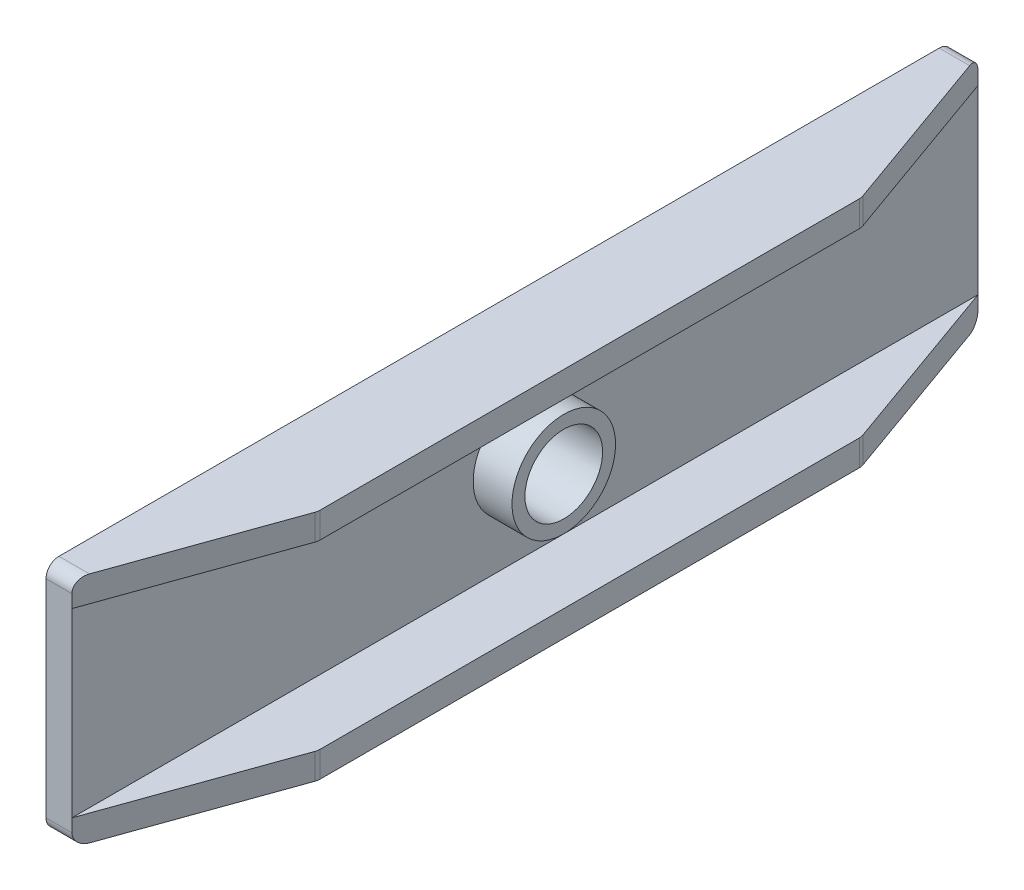
ISO-10303-21;
HEADER;
FILE_DESCRIPTION(('STEP AP214'),'2;1');
FILE_NAME('part.step','',(''),(''),'','','');
FILE_SCHEMA(('AUTOMOTIVE_DESIGN { 1 0 10303 214 1 1 1 1 }'));
ENDSEC;
DATA;
#1=APPLICATION_CONTEXT('core data for automotive mechanical design processes');
#2=APPLICATION_PROTOCOL_DEFINITION('international standard','automotive_design',2000,#1);
#3=PRODUCT_CONTEXT('',#1,'mechanical');
#4=PRODUCT('Part','Part','',(#3));
#5=PRODUCT_RELATED_PRODUCT_CATEGORY('part','',(#4));
#6=PRODUCT_DEFINITION_FORMATION('','',#4);
#7=PRODUCT_DEFINITION_CONTEXT('part definition',#1,'design');
#8=PRODUCT_DEFINITION('design','',#6,#7);
#9=PRODUCT_DEFINITION_SHAPE('','',#8);
#10=(LENGTH_UNIT() NAMED_UNIT(*) SI_UNIT(.MILLI.,.METRE.));
#11=(NAMED_UNIT(*) PLANE_ANGLE_UNIT() SI_UNIT($,.RADIAN.));
#12=(NAMED_UNIT(*) SI_UNIT($,.STERADIAN.) SOLID_ANGLE_UNIT());
#13=UNCERTAINTY_MEASURE_WITH_UNIT(LENGTH_MEASURE(1.E-05),#10,'distance_accuracy_value','');
#14=(GEOMETRIC_REPRESENTATION_CONTEXT(3) GLOBAL_UNCERTAINTY_ASSIGNED_CONTEXT((#13)) GLOBAL_UNIT_ASSIGNED_CONTEXT((#10,
#11,#12)) REPRESENTATION_CONTEXT('',''));
#15=CARTESIAN_POINT('',(0.,0.,0.));
#16=DIRECTION('',(0.,0.,1.));
#17=DIRECTION('',(1.,0.,0.));
#18=AXIS2_PLACEMENT_3D('',#15,#16,#17);
#19=CARTESIAN_POINT('',(3.,-3.5,-17.5));
#20=DIRECTION('',(0.,1.,0.));
#21=DIRECTION('',(0.,0.,1.));
#22=AXIS2_PLACEMENT_3D('',#19,#20,#21);
#23=PLANE('',#22);
#24=DIRECTION('',(0.,0.,-1.));
#25=VECTOR('',#24,1.);
#26=CARTESIAN_POINT('',(3.,-3.5,-17.5));
#27=LINE('',#26,#25);
#28=CARTESIAN_POINT('',(3.,-3.5,-10.41339312527));
#29=VERTEX_POINT('',#28);
#30=CARTESIAN_POINT('',(3.,-3.5,10.41339312527));
#31=VERTEX_POINT('',#30);
#32=EDGE_CURVE('E148',#29,#31,#27,.F.);
#33=ORIENTED_EDGE('',*,*,#32,.F.);
#34=CARTESIAN_POINT('',(2.5,-3.5,-10.41339312527));
#35=DIRECTION('',(0.,1.,0.));
#36=DIRECTION('',(0.,0.,1.));
#37=AXIS2_PLACEMENT_3D('',#34,#35,#36);
#38=CIRCLE('',#37,0.5);
#39=CARTESIAN_POINT('',(2.97087095579714,-3.5,-10.5815613237695));
#40=VERTEX_POINT('',#39);
#41=EDGE_CURVE('E191',#40,#29,#38,.F.);
#42=ORIENTED_EDGE('',*,*,#41,.F.);
#43=DIRECTION('',(0.336336396998207,0.,0.941741911594819));
#44=VECTOR('',#43,1.);
#45=CARTESIAN_POINT('',(0.5,-3.5,-17.5));
#46=LINE('',#45,#44);
#47=CARTESIAN_POINT('',(0.5,-3.5,-17.5));
#48=VERTEX_POINT('',#47);
#49=EDGE_CURVE('E203',#40,#48,#46,.F.);
#50=ORIENTED_EDGE('',*,*,#49,.T.);
#51=DIRECTION('',(0.,0.,-1.));
#52=VECTOR('',#51,1.);
#53=CARTESIAN_POINT('',(0.5,-3.5,-17.5));
#54=LINE('',#53,#52);
#55=CARTESIAN_POINT('',(0.499999999999812,-3.5,17.4999999999999));
#56=VERTEX_POINT('',#55);
#57=EDGE_CURVE('E190',#56,#48,#54,.T.);
#58=ORIENTED_EDGE('',*,*,#57,.F.);
#59=DIRECTION('',(-0.336336396998207,0.,0.941741911594819));
#60=VECTOR('',#59,1.);
#61=CARTESIAN_POINT('',(3.,-3.5,10.5));
#62=LINE('',#61,#60);
#63=CARTESIAN_POINT('',(2.97087095579665,-3.5,10.5815613237694));
#64=VERTEX_POINT('',#63);
#65=EDGE_CURVE('E209',#56,#64,#62,.F.);
#66=ORIENTED_EDGE('',*,*,#65,.T.);
#67=CARTESIAN_POINT('',(2.5,-3.5,10.41339312527));
#68=DIRECTION('',(0.,-1.,0.));
#69=DIRECTION('',(0.,0.,-1.));
#70=AXIS2_PLACEMENT_3D('',#67,#68,#69);
#71=CIRCLE('',#70,0.5);
#72=EDGE_CURVE('E215',#31,#64,#71,.T.);
#73=ORIENTED_EDGE('',*,*,#72,.F.);
#74=EDGE_LOOP('',(#33,#42,#50,#58,#66,#73));
#75=FACE_BOUND('',#74,.T.);
#76=ADVANCED_FACE('F17',(#75),#23,.T.);
#77=CARTESIAN_POINT('',(0.5,3.5,-17.5));
#78=DIRECTION('',(0.,-1.,0.));
#79=DIRECTION('',(0.,0.,-1.));
#80=AXIS2_PLACEMENT_3D('',#77,#78,#79);
#81=PLANE('',#80);
#82=DIRECTION('',(0.336336396998207,0.,0.941741911594819));
#83=VECTOR('',#82,1.);
#84=CARTESIAN_POINT('',(0.5,3.5,-17.5));
#85=LINE('',#84,#83);
#86=CARTESIAN_POINT('',(0.5,3.5,-17.5));
#87=VERTEX_POINT('',#86);
#88=CARTESIAN_POINT('',(2.97087095579714,3.5,-10.5815613237695));
#89=VERTEX_POINT('',#88);
#90=EDGE_CURVE('E146',#87,#89,#85,.T.);
#91=ORIENTED_EDGE('',*,*,#90,.T.);
#92=CARTESIAN_POINT('',(2.5,3.5,-10.41339312527));
#93=DIRECTION('',(0.,1.,0.));
#94=DIRECTION('',(0.,0.,1.));
#95=AXIS2_PLACEMENT_3D('',#92,#93,#94);
#96=CIRCLE('',#95,0.5);
#97=CARTESIAN_POINT('',(3.,3.5,-10.41339312527));
#98=VERTEX_POINT('',#97);
#99=EDGE_CURVE('E20',#89,#98,#96,.F.);
#100=ORIENTED_EDGE('',*,*,#99,.T.);
#101=DIRECTION('',(0.,0.,-1.));
#102=VECTOR('',#101,1.);
#103=CARTESIAN_POINT('',(3.,3.5,-17.5));
#104=LINE('',#103,#102);
#105=CARTESIAN_POINT('',(3.,3.5,10.41339312527));
#106=VERTEX_POINT('',#105);
#107=EDGE_CURVE('E142',#106,#98,#104,.T.);
#108=ORIENTED_EDGE('',*,*,#107,.F.);
#109=CARTESIAN_POINT('',(2.5,3.5,10.41339312527));
#110=DIRECTION('',(0.,-1.,0.));
#111=DIRECTION('',(0.,0.,-1.));
#112=AXIS2_PLACEMENT_3D('',#109,#110,#111);
#113=CIRCLE('',#112,0.5);
#114=CARTESIAN_POINT('',(2.97087095579695,3.5,10.5815613237695));
#115=VERTEX_POINT('',#114);
#116=EDGE_CURVE('E167',#115,#106,#113,.F.);
#117=ORIENTED_EDGE('',*,*,#116,.F.);
#118=DIRECTION('',(-0.336336396998207,0.,0.941741911594819));
#119=VECTOR('',#118,1.);
#120=CARTESIAN_POINT('',(3.,3.5,10.5));
#121=LINE('',#120,#119);
#122=CARTESIAN_POINT('',(0.499999999999906,3.5,17.5));
#123=VERTEX_POINT('',#122);
#124=EDGE_CURVE('E171',#115,#123,#121,.T.);
#125=ORIENTED_EDGE('',*,*,#124,.T.);
#126=DIRECTION('',(0.,0.,-1.));
#127=VECTOR('',#126,1.);
#128=CARTESIAN_POINT('',(0.5,3.5,-17.5));
#129=LINE('',#128,#127);
#130=EDGE_CURVE('E187',#87,#123,#129,.F.);
#131=ORIENTED_EDGE('',*,*,#130,.F.);
#132=EDGE_LOOP('',(#91,#100,#108,#117,#125,#131));
#133=FACE_BOUND('',#132,.T.);
#134=ADVANCED_FACE('F140',(#133),#81,.T.);
#135=CARTESIAN_POINT('',(0.5,0.,0.));
#136=DIRECTION('',(1.,0.,0.));
#137=DIRECTION('',(0.,0.,-1.));
#138=AXIS2_PLACEMENT_3D('',#135,#136,#137);
#139=CYLINDRICAL_SURFACE('',#138,2.);
#140=CARTESIAN_POINT('',(2.,0.,0.));
#141=DIRECTION('',(1.,0.,0.));
#142=DIRECTION('',(0.,0.,-1.));
#143=AXIS2_PLACEMENT_3D('',#140,#141,#142);
#144=CIRCLE('',#143,2.);
#145=CARTESIAN_POINT('',(2.,0.,-2.));
#146=VERTEX_POINT('',#145);
#147=EDGE_CURVE('E162',#146,#146,#144,.T.);
#148=ORIENTED_EDGE('',*,*,#147,.F.);
#149=EDGE_LOOP('',(#148));
#150=FACE_BOUND('',#149,.T.);
#151=CARTESIAN_POINT('',(0.5,0.,0.));
#152=DIRECTION('',(1.,0.,0.));
#153=DIRECTION('',(0.,0.,-1.));
#154=AXIS2_PLACEMENT_3D('',#151,#152,#153);
#155=CIRCLE('',#154,2.);
#156=CARTESIAN_POINT('',(0.5,0.,-2.));
#157=VERTEX_POINT('',#156);
#158=EDGE_CURVE('E196',#157,#157,#155,.F.);
#159=ORIENTED_EDGE('',*,*,#158,.F.);
#160=EDGE_LOOP('',(#159));
#161=FACE_BOUND('',#160,.T.);
#162=ADVANCED_FACE('F567',(#150,#161),#139,.T.);
#163=CARTESIAN_POINT('',(3.,-4.5,-17.5));
#164=DIRECTION('',(1.,0.,0.));
#165=DIRECTION('',(0.,0.,-1.));
#166=AXIS2_PLACEMENT_3D('',#163,#164,#165);
#167=PLANE('',#166);
#168=DIRECTION('',(0.,0.,-1.));
#169=VECTOR('',#168,1.);
#170=CARTESIAN_POINT('',(3.,-4.5,-17.5));
#171=LINE('',#170,#169);
#172=CARTESIAN_POINT('',(3.,-4.5,-10.41339312527));
#173=VERTEX_POINT('',#172);
#174=CARTESIAN_POINT('',(3.,-4.5,10.41339312527));
#175=VERTEX_POINT('',#174);
#176=EDGE_CURVE('E279',#173,#175,#171,.F.);
#177=ORIENTED_EDGE('',*,*,#176,.F.);
#178=DIRECTION('',(0.,1.,0.));
#179=VECTOR('',#178,1.);
#180=CARTESIAN_POINT('',(3.,-16.2324,-10.41339312527));
#181=LINE('',#180,#179);
#182=EDGE_CURVE('E199',#29,#173,#181,.F.);
#183=ORIENTED_EDGE('',*,*,#182,.F.);
#184=ORIENTED_EDGE('',*,*,#32,.T.);
#185=DIRECTION('',(0.,-1.,0.));
#186=VECTOR('',#185,1.);
#187=CARTESIAN_POINT('',(3.,16.2324,10.41339312527));
#188=LINE('',#187,#186);
#189=EDGE_CURVE('E216',#175,#31,#188,.F.);
#190=ORIENTED_EDGE('',*,*,#189,.F.);
#191=EDGE_LOOP('',(#177,#183,#184,#190));
#192=FACE_BOUND('',#191,.T.);
#193=ADVANCED_FACE('F356',(#192),#167,.T.);
#194=CARTESIAN_POINT('',(2.5,16.2324,10.41339312527));
#195=DIRECTION('',(0.,-1.,0.));
#196=DIRECTION('',(0.,0.,-1.));
#197=AXIS2_PLACEMENT_3D('',#194,#195,#196);
#198=CYLINDRICAL_SURFACE('',#197,0.5);
#199=DIRECTION('',(0.,1.,0.));
#200=VECTOR('',#199,1.);
#201=CARTESIAN_POINT('',(2.97087095579649,4.5,10.5815613237698));
#202=LINE('',#201,#200);
#203=CARTESIAN_POINT('',(2.97087095579691,-4.5,10.5815613237695));
#204=VERTEX_POINT('',#203);
#205=EDGE_CURVE('E213',#64,#204,#202,.F.);
#206=ORIENTED_EDGE('',*,*,#205,.T.);
#207=CARTESIAN_POINT('',(2.5,-4.5,10.41339312527));
#208=DIRECTION('',(0.,-1.,0.));
#209=DIRECTION('',(0.,0.,-1.));
#210=AXIS2_PLACEMENT_3D('',#207,#208,#209);
#211=CIRCLE('',#210,0.5);
#212=EDGE_CURVE('E275',#175,#204,#211,.T.);
#213=ORIENTED_EDGE('',*,*,#212,.F.);
#214=ORIENTED_EDGE('',*,*,#189,.T.);
#215=ORIENTED_EDGE('',*,*,#72,.T.);
#216=EDGE_LOOP('',(#206,#213,#214,#215));
#217=FACE_BOUND('',#216,.T.);
#218=ADVANCED_FACE('F293',(#217),#198,.T.);
#219=CARTESIAN_POINT('',(3.,4.5,10.5));
#220=DIRECTION('',(-0.941741911594819,0.,-0.336336396998207));
#221=DIRECTION('',(-0.336336396998207,0.,0.941741911594819));
#222=AXIS2_PLACEMENT_3D('',#219,#220,#221);
#223=PLANE('',#222);
#224=DIRECTION('',(0.,1.,0.));
#225=VECTOR('',#224,1.);
#226=CARTESIAN_POINT('',(0.499999999999624,4.5,17.4999999999999));
#227=LINE('',#226,#225);
#228=CARTESIAN_POINT('',(0.499999999999599,-4.,17.5));
#229=VERTEX_POINT('',#228);
#230=EDGE_CURVE('E206',#229,#56,#227,.T.);
#231=ORIENTED_EDGE('',*,*,#230,.F.);
#232=CARTESIAN_POINT('',(0.678571428571034,-4.,17.));
#233=DIRECTION('',(-0.941741911594819,0.,-0.336336396998207));
#234=DIRECTION('',(0.336336396998207,0.,-0.941741911594819));
#235=AXIS2_PLACEMENT_3D('',#232,#233,#234);
#236=ELLIPSE('',#235,0.530931026689957,0.5);
#237=CARTESIAN_POINT('',(0.678571428571217,-4.5,17.));
#238=VERTEX_POINT('',#237);
#239=EDGE_CURVE('E210',#238,#229,#236,.T.);
#240=ORIENTED_EDGE('',*,*,#239,.F.);
#241=DIRECTION('',(-0.336336396998234,0.,0.941741911594809));
#242=VECTOR('',#241,1.);
#243=CARTESIAN_POINT('',(2.970870955797,-4.5,10.58156132377));
#244=LINE('',#243,#242);
#245=EDGE_CURVE('E278',#204,#238,#244,.T.);
#246=ORIENTED_EDGE('',*,*,#245,.F.);
#247=ORIENTED_EDGE('',*,*,#205,.F.);
#248=ORIENTED_EDGE('',*,*,#65,.F.);
#249=EDGE_LOOP('',(#231,#240,#246,#247,#248));
#250=FACE_BOUND('',#249,.T.);
#251=ADVANCED_FACE('F302',(#250),#223,.F.);
#252=CARTESIAN_POINT('',(0.5,4.5,-17.5));
#253=DIRECTION('',(-0.941741911594819,0.,0.336336396998207));
#254=DIRECTION('',(0.336336396998207,0.,0.941741911594819));
#255=AXIS2_PLACEMENT_3D('',#252,#253,#254);
#256=PLANE('',#255);
#257=CARTESIAN_POINT('',(0.678571428571458,-4.,-17.));
#258=DIRECTION('',(-0.941741911594819,0.,0.336336396998207));
#259=DIRECTION('',(-0.336336396998207,0.,-0.941741911594819));
#260=AXIS2_PLACEMENT_3D('',#257,#258,#259);
#261=ELLIPSE('',#260,0.530931026689957,0.5);
#262=CARTESIAN_POINT('',(0.499999999999999,-4.,-17.5));
#263=VERTEX_POINT('',#262);
#264=CARTESIAN_POINT('',(0.678571428571429,-4.5,-17.));
#265=VERTEX_POINT('',#264);
#266=EDGE_CURVE('E280',#263,#265,#261,.T.);
#267=ORIENTED_EDGE('',*,*,#266,.F.);
#268=DIRECTION('',(0.,1.,0.));
#269=VECTOR('',#268,1.);
#270=CARTESIAN_POINT('',(0.5,0.,-17.5));
#271=LINE('',#270,#269);
#272=EDGE_CURVE('E219',#263,#48,#271,.T.);
#273=ORIENTED_EDGE('',*,*,#272,.T.);
#274=ORIENTED_EDGE('',*,*,#49,.F.);
#275=DIRECTION('',(0.,1.,0.));
#276=VECTOR('',#275,1.);
#277=CARTESIAN_POINT('',(2.97087095579708,-16.2324,-10.58156132377));
#278=LINE('',#277,#276);
#279=CARTESIAN_POINT('',(2.9708709557972,-4.5,-10.5815613237696));
#280=VERTEX_POINT('',#279);
#281=EDGE_CURVE('E202',#280,#40,#278,.T.);
#282=ORIENTED_EDGE('',*,*,#281,.F.);
#283=DIRECTION('',(0.336336396998234,0.,0.941741911594809));
#284=VECTOR('',#283,1.);
#285=CARTESIAN_POINT('',(0.6785714285714,-4.5,-17.));
#286=LINE('',#285,#284);
#287=EDGE_CURVE('E274',#265,#280,#286,.T.);
#288=ORIENTED_EDGE('',*,*,#287,.F.);
#289=EDGE_LOOP('',(#267,#273,#274,#282,#288));
#290=FACE_BOUND('',#289,.T.);
#291=ADVANCED_FACE('F352',(#290),#256,.F.);
#292=CARTESIAN_POINT('',(2.5,-16.2324,-10.41339312527));
#293=DIRECTION('',(0.,1.,0.));
#294=DIRECTION('',(0.,0.,1.));
#295=AXIS2_PLACEMENT_3D('',#292,#293,#294);
#296=CYLINDRICAL_SURFACE('',#295,0.5);
#297=ORIENTED_EDGE('',*,*,#281,.T.);
#298=ORIENTED_EDGE('',*,*,#41,.T.);
#299=ORIENTED_EDGE('',*,*,#182,.T.);
#300=CARTESIAN_POINT('',(2.5,-4.5,-10.41339312527));
#301=DIRECTION('',(0.,1.,0.));
#302=DIRECTION('',(0.,0.,1.));
#303=AXIS2_PLACEMENT_3D('',#300,#301,#302);
#304=CIRCLE('',#303,0.5);
#305=EDGE_CURVE('E270',#280,#173,#304,.F.);
#306=ORIENTED_EDGE('',*,*,#305,.F.);
#307=EDGE_LOOP('',(#297,#298,#299,#306));
#308=FACE_BOUND('',#307,.T.);
#309=ADVANCED_FACE('F355',(#308),#296,.T.);
#310=CARTESIAN_POINT('',(0.5,-3.5,-17.5));
#311=DIRECTION('',(1.,0.,0.));
#312=DIRECTION('',(0.,0.,-1.));
#313=AXIS2_PLACEMENT_3D('',#310,#311,#312);
#314=PLANE('',#313);
#315=ORIENTED_EDGE('',*,*,#158,.T.);
#316=EDGE_LOOP('',(#315));
#317=FACE_BOUND('',#316,.T.);
#318=ORIENTED_EDGE('',*,*,#57,.T.);
#319=DIRECTION('',(0.,1.,0.));
#320=VECTOR('',#319,1.);
#321=CARTESIAN_POINT('',(0.5,0.,-17.5));
#322=LINE('',#321,#320);
#323=EDGE_CURVE('E222',#48,#87,#322,.T.);
#324=ORIENTED_EDGE('',*,*,#323,.T.);
#325=ORIENTED_EDGE('',*,*,#130,.T.);
#326=DIRECTION('',(0.,1.,0.));
#327=VECTOR('',#326,1.);
#328=CARTESIAN_POINT('',(0.5,0.,17.5));
#329=LINE('',#328,#327);
#330=EDGE_CURVE('E175',#56,#123,#329,.T.);
#331=ORIENTED_EDGE('',*,*,#330,.F.);
#332=EDGE_LOOP('',(#318,#324,#325,#331));
#333=FACE_BOUND('',#332,.T.);
#334=ADVANCED_FACE('F359',(#317,#333),#314,.T.);
#335=CARTESIAN_POINT('',(0.5,4.5,-17.5));
#336=DIRECTION('',(-0.941741911594819,0.,0.336336396998207));
#337=DIRECTION('',(0.336336396998207,0.,0.941741911594819));
#338=AXIS2_PLACEMENT_3D('',#335,#336,#337);
#339=PLANE('',#338);
#340=DIRECTION('',(0.,1.,0.));
#341=VECTOR('',#340,1.);
#342=CARTESIAN_POINT('',(0.5,0.,-17.5));
#343=LINE('',#342,#341);
#344=CARTESIAN_POINT('',(0.499999999999999,4.,-17.5));
#345=VERTEX_POINT('',#344);
#346=EDGE_CURVE('E231',#87,#345,#343,.T.);
#347=ORIENTED_EDGE('',*,*,#346,.T.);
#348=CARTESIAN_POINT('',(0.678571428571458,4.,-17.));
#349=DIRECTION('',(-0.941741911594819,0.,0.336336396998207));
#350=DIRECTION('',(0.336336396998207,0.,0.941741911594819));
#351=AXIS2_PLACEMENT_3D('',#348,#349,#350);
#352=ELLIPSE('',#351,0.530931026689957,0.5);
#353=CARTESIAN_POINT('',(0.678571428571429,4.5,-17.));
#354=VERTEX_POINT('',#353);
#355=EDGE_CURVE('E226',#354,#345,#352,.T.);
#356=ORIENTED_EDGE('',*,*,#355,.F.);
#357=DIRECTION('',(-0.336336396998234,0.,-0.941741911594809));
#358=VECTOR('',#357,1.);
#359=CARTESIAN_POINT('',(2.970870955797,4.5,-10.58156132377));
#360=LINE('',#359,#358);
#361=CARTESIAN_POINT('',(2.9708709557972,4.5,-10.5815613237696));
#362=VERTEX_POINT('',#361);
#363=EDGE_CURVE('E269',#362,#354,#360,.T.);
#364=ORIENTED_EDGE('',*,*,#363,.F.);
#365=DIRECTION('',(0.,1.,0.));
#366=VECTOR('',#365,1.);
#367=CARTESIAN_POINT('',(2.97087095579708,-16.2324,-10.58156132377));
#368=LINE('',#367,#366);
#369=EDGE_CURVE('E160',#89,#362,#368,.T.);
#370=ORIENTED_EDGE('',*,*,#369,.F.);
#371=ORIENTED_EDGE('',*,*,#90,.F.);
#372=EDGE_LOOP('',(#347,#356,#364,#370,#371));
#373=FACE_BOUND('',#372,.T.);
#374=ADVANCED_FACE('F326',(#373),#339,.F.);
#375=CARTESIAN_POINT('',(3.,4.5,10.5));
#376=DIRECTION('',(-0.941741911594819,0.,-0.336336396998207));
#377=DIRECTION('',(-0.336336396998207,0.,0.941741911594819));
#378=AXIS2_PLACEMENT_3D('',#375,#376,#377);
#379=PLANE('',#378);
#380=CARTESIAN_POINT('',(0.678571428571034,4.,17.));
#381=DIRECTION('',(-0.941741911594819,0.,-0.336336396998207));
#382=DIRECTION('',(-0.336336396998207,0.,0.941741911594819));
#383=AXIS2_PLACEMENT_3D('',#380,#381,#382);
#384=ELLIPSE('',#383,0.530931026689957,0.5);
#385=CARTESIAN_POINT('',(0.499999999999787,4.,17.5));
#386=VERTEX_POINT('',#385);
#387=CARTESIAN_POINT('',(0.678571428571217,4.5,17.));
#388=VERTEX_POINT('',#387);
#389=EDGE_CURVE('E267',#386,#388,#384,.T.);
#390=ORIENTED_EDGE('',*,*,#389,.F.);
#391=DIRECTION('',(0.,1.,0.));
#392=VECTOR('',#391,1.);
#393=CARTESIAN_POINT('',(0.5,0.,17.5));
#394=LINE('',#393,#392);
#395=EDGE_CURVE('E172',#123,#386,#394,.T.);
#396=ORIENTED_EDGE('',*,*,#395,.F.);
#397=ORIENTED_EDGE('',*,*,#124,.F.);
#398=DIRECTION('',(0.,-1.,0.));
#399=VECTOR('',#398,1.);
#400=CARTESIAN_POINT('',(2.97087095579708,16.2324,10.58156132377));
#401=LINE('',#400,#399);
#402=CARTESIAN_POINT('',(2.9708709557972,4.5,10.5815613237696));
#403=VERTEX_POINT('',#402);
#404=EDGE_CURVE('E168',#403,#115,#401,.T.);
#405=ORIENTED_EDGE('',*,*,#404,.F.);
#406=DIRECTION('',(0.336336396998234,0.,-0.941741911594809));
#407=VECTOR('',#406,1.);
#408=CARTESIAN_POINT('',(0.6785714285714,4.5,17.));
#409=LINE('',#408,#407);
#410=EDGE_CURVE('E266',#388,#403,#409,.T.);
#411=ORIENTED_EDGE('',*,*,#410,.F.);
#412=EDGE_LOOP('',(#390,#396,#397,#405,#411));
#413=FACE_BOUND('',#412,.T.);
#414=ADVANCED_FACE('F367',(#413),#379,.F.);
#415=CARTESIAN_POINT('',(2.5,16.2324,10.41339312527));
#416=DIRECTION('',(0.,-1.,0.));
#417=DIRECTION('',(0.,0.,-1.));
#418=AXIS2_PLACEMENT_3D('',#415,#416,#417);
#419=CYLINDRICAL_SURFACE('',#418,0.5);
#420=ORIENTED_EDGE('',*,*,#404,.T.);
#421=ORIENTED_EDGE('',*,*,#116,.T.);
#422=DIRECTION('',(0.,1.,0.));
#423=VECTOR('',#422,1.);
#424=CARTESIAN_POINT('',(3.,3.5,10.41339312527));
#425=LINE('',#424,#423);
#426=CARTESIAN_POINT('',(3.,4.5,10.41339312527));
#427=VERTEX_POINT('',#426);
#428=EDGE_CURVE('E154',#427,#106,#425,.F.);
#429=ORIENTED_EDGE('',*,*,#428,.F.);
#430=CARTESIAN_POINT('',(2.5,4.5,10.41339312527));
#431=DIRECTION('',(0.,-1.,0.));
#432=DIRECTION('',(0.,0.,-1.));
#433=AXIS2_PLACEMENT_3D('',#430,#431,#432);
#434=CIRCLE('',#433,0.5);
#435=EDGE_CURVE('E263',#403,#427,#434,.F.);
#436=ORIENTED_EDGE('',*,*,#435,.F.);
#437=EDGE_LOOP('',(#420,#421,#429,#436));
#438=FACE_BOUND('',#437,.T.);
#439=ADVANCED_FACE('F501',(#438),#419,.T.);
#440=CARTESIAN_POINT('',(3.,3.5,-17.5));
#441=DIRECTION('',(1.,0.,0.));
#442=DIRECTION('',(0.,0.,-1.));
#443=AXIS2_PLACEMENT_3D('',#440,#441,#442);
#444=PLANE('',#443);
#445=ORIENTED_EDGE('',*,*,#107,.T.);
#446=DIRECTION('',(0.,1.,0.));
#447=VECTOR('',#446,1.);
#448=CARTESIAN_POINT('',(3.,-16.2324,-10.41339312527));
#449=LINE('',#448,#447);
#450=CARTESIAN_POINT('',(3.,4.5,-10.41339312527));
#451=VERTEX_POINT('',#450);
#452=EDGE_CURVE('E152',#451,#98,#449,.F.);
#453=ORIENTED_EDGE('',*,*,#452,.F.);
#454=DIRECTION('',(0.,0.,1.));
#455=VECTOR('',#454,1.);
#456=CARTESIAN_POINT('',(3.,4.5,-17.5));
#457=LINE('',#456,#455);
#458=EDGE_CURVE('E262',#427,#451,#457,.F.);
#459=ORIENTED_EDGE('',*,*,#458,.F.);
#460=ORIENTED_EDGE('',*,*,#428,.T.);
#461=EDGE_LOOP('',(#445,#453,#459,#460));
#462=FACE_BOUND('',#461,.T.);
#463=ADVANCED_FACE('F150',(#462),#444,.T.);
#464=CARTESIAN_POINT('',(2.5,-16.2324,-10.41339312527));
#465=DIRECTION('',(0.,1.,0.));
#466=DIRECTION('',(0.,0.,1.));
#467=AXIS2_PLACEMENT_3D('',#464,#465,#466);
#468=CYLINDRICAL_SURFACE('',#467,0.5);
#469=ORIENTED_EDGE('',*,*,#369,.T.);
#470=CARTESIAN_POINT('',(2.5,4.5,-10.41339312527));
#471=DIRECTION('',(0.,1.,0.));
#472=DIRECTION('',(0.,0.,1.));
#473=AXIS2_PLACEMENT_3D('',#470,#471,#472);
#474=CIRCLE('',#473,0.5);
#475=EDGE_CURVE('E158',#451,#362,#474,.T.);
#476=ORIENTED_EDGE('',*,*,#475,.F.);
#477=ORIENTED_EDGE('',*,*,#452,.T.);
#478=ORIENTED_EDGE('',*,*,#99,.F.);
#479=EDGE_LOOP('',(#469,#476,#477,#478));
#480=FACE_BOUND('',#479,.T.);
#481=ADVANCED_FACE('F156',(#480),#468,.T.);
#482=CARTESIAN_POINT('',(2.,0.,-17.5));
#483=DIRECTION('',(1.,0.,0.));
#484=DIRECTION('',(0.,0.,-1.));
#485=AXIS2_PLACEMENT_3D('',#482,#483,#484);
#486=PLANE('',#485);
#487=CARTESIAN_POINT('',(2.,0.,0.));
#488=DIRECTION('',(-1.,0.,0.));
#489=DIRECTION('',(0.,0.,1.));
#490=AXIS2_PLACEMENT_3D('',#487,#488,#489);
#491=CIRCLE('',#490,1.5);
#492=CARTESIAN_POINT('',(2.,0.,1.5));
#493=VERTEX_POINT('',#492);
#494=EDGE_CURVE('E257',#493,#493,#491,.T.);
#495=ORIENTED_EDGE('',*,*,#494,.T.);
#496=EDGE_LOOP('',(#495));
#497=FACE_BOUND('',#496,.T.);
#498=ORIENTED_EDGE('',*,*,#147,.T.);
#499=EDGE_LOOP('',(#498));
#500=FACE_BOUND('',#499,.T.);
#501=ADVANCED_FACE('F395',(#497,#500),#486,.T.);
#502=CARTESIAN_POINT('',(0.,0.,-17.5));
#503=DIRECTION('',(0.,0.,1.));
#504=DIRECTION('',(1.,0.,0.));
#505=AXIS2_PLACEMENT_3D('',#502,#503,#504);
#506=PLANE('',#505);
#507=ORIENTED_EDGE('',*,*,#323,.F.);
#508=ORIENTED_EDGE('',*,*,#272,.F.);
#509=DIRECTION('',(-1.,0.,0.));
#510=VECTOR('',#509,1.);
#511=CARTESIAN_POINT('',(7.5626,-4.,-17.5));
#512=LINE('',#511,#510);
#513=CARTESIAN_POINT('',(-0.5,-4.,-17.5));
#514=VERTEX_POINT('',#513);
#515=EDGE_CURVE('E282',#514,#263,#512,.F.);
#516=ORIENTED_EDGE('',*,*,#515,.F.);
#517=DIRECTION('',(0.,1.,0.));
#518=VECTOR('',#517,1.);
#519=CARTESIAN_POINT('',(-0.5,4.5,-17.5));
#520=LINE('',#519,#518);
#521=CARTESIAN_POINT('',(-0.5,4.,-17.5));
#522=VERTEX_POINT('',#521);
#523=EDGE_CURVE('E256',#522,#514,#520,.F.);
#524=ORIENTED_EDGE('',*,*,#523,.F.);
#525=DIRECTION('',(1.,0.,0.));
#526=VECTOR('',#525,1.);
#527=CARTESIAN_POINT('',(-5.0626,4.,-17.5));
#528=LINE('',#527,#526);
#529=EDGE_CURVE('E261',#345,#522,#528,.F.);
#530=ORIENTED_EDGE('',*,*,#529,.F.);
#531=ORIENTED_EDGE('',*,*,#346,.F.);
#532=EDGE_LOOP('',(#507,#508,#516,#524,#530,#531));
#533=FACE_BOUND('',#532,.T.);
#534=ADVANCED_FACE('F330',(#533),#506,.F.);
#535=CARTESIAN_POINT('',(7.5626,-4.,-17.));
#536=DIRECTION('',(-1.,0.,0.));
#537=DIRECTION('',(0.,0.,1.));
#538=AXIS2_PLACEMENT_3D('',#535,#536,#537);
#539=CYLINDRICAL_SURFACE('',#538,0.5);
#540=DIRECTION('',(1.,0.,0.));
#541=VECTOR('',#540,1.);
#542=CARTESIAN_POINT('',(-0.5,-4.5,-17.));
#543=LINE('',#542,#541);
#544=CARTESIAN_POINT('',(-0.5,-4.5,-17.));
#545=VERTEX_POINT('',#544);
#546=EDGE_CURVE('E306',#545,#265,#543,.T.);
#547=ORIENTED_EDGE('',*,*,#546,.F.);
#548=CARTESIAN_POINT('',(-0.5,-4.,-17.));
#549=DIRECTION('',(-1.,0.,0.));
#550=DIRECTION('',(0.,0.,1.));
#551=AXIS2_PLACEMENT_3D('',#548,#549,#550);
#552=CIRCLE('',#551,0.5);
#553=EDGE_CURVE('E253',#514,#545,#552,.T.);
#554=ORIENTED_EDGE('',*,*,#553,.F.);
#555=ORIENTED_EDGE('',*,*,#515,.T.);
#556=ORIENTED_EDGE('',*,*,#266,.T.);
#557=EDGE_LOOP('',(#547,#554,#555,#556));
#558=FACE_BOUND('',#557,.T.);
#559=ADVANCED_FACE('F386',(#558),#539,.T.);
#560=CARTESIAN_POINT('',(-0.5,-4.5,-17.5));
#561=DIRECTION('',(0.,-1.,0.));
#562=DIRECTION('',(0.,0.,-1.));
#563=AXIS2_PLACEMENT_3D('',#560,#561,#562);
#564=PLANE('',#563);
#565=ORIENTED_EDGE('',*,*,#287,.T.);
#566=ORIENTED_EDGE('',*,*,#305,.T.);
#567=ORIENTED_EDGE('',*,*,#176,.T.);
#568=ORIENTED_EDGE('',*,*,#212,.T.);
#569=ORIENTED_EDGE('',*,*,#245,.T.);
#570=DIRECTION('',(1.,0.,0.));
#571=VECTOR('',#570,1.);
#572=CARTESIAN_POINT('',(-5.0626,-4.5,17.));
#573=LINE('',#572,#571);
#574=CARTESIAN_POINT('',(-0.5,-4.5,17.));
#575=VERTEX_POINT('',#574);
#576=EDGE_CURVE('E273',#575,#238,#573,.T.);
#577=ORIENTED_EDGE('',*,*,#576,.F.);
#578=DIRECTION('',(0.,0.,1.));
#579=VECTOR('',#578,1.);
#580=CARTESIAN_POINT('',(-0.5,-4.5,-17.5));
#581=LINE('',#580,#579);
#582=EDGE_CURVE('E252',#545,#575,#581,.T.);
#583=ORIENTED_EDGE('',*,*,#582,.F.);
#584=ORIENTED_EDGE('',*,*,#546,.T.);
#585=EDGE_LOOP('',(#565,#566,#567,#568,#569,#577,#583,#584));
#586=FACE_BOUND('',#585,.T.);
#587=ADVANCED_FACE('F310',(#586),#564,.T.);
#588=CARTESIAN_POINT('',(-5.0626,-4.,17.));
#589=DIRECTION('',(1.,0.,0.));
#590=DIRECTION('',(0.,0.,-1.));
#591=AXIS2_PLACEMENT_3D('',#588,#589,#590);
#592=CYLINDRICAL_SURFACE('',#591,0.5);
#593=ORIENTED_EDGE('',*,*,#576,.T.);
#594=ORIENTED_EDGE('',*,*,#239,.T.);
#595=DIRECTION('',(1.,0.,0.));
#596=VECTOR('',#595,1.);
#597=CARTESIAN_POINT('',(0.,-4.,17.5));
#598=LINE('',#597,#596);
#599=CARTESIAN_POINT('',(-0.5,-4.,17.5));
#600=VERTEX_POINT('',#599);
#601=EDGE_CURVE('E184',#600,#229,#598,.T.);
#602=ORIENTED_EDGE('',*,*,#601,.F.);
#603=CARTESIAN_POINT('',(-0.5,-4.,17.));
#604=DIRECTION('',(1.,0.,0.));
#605=DIRECTION('',(0.,0.,-1.));
#606=AXIS2_PLACEMENT_3D('',#603,#604,#605);
#607=CIRCLE('',#606,0.5);
#608=EDGE_CURVE('E249',#575,#600,#607,.F.);
#609=ORIENTED_EDGE('',*,*,#608,.F.);
#610=EDGE_LOOP('',(#593,#594,#602,#609));
#611=FACE_BOUND('',#610,.T.);
#612=ADVANCED_FACE('F382',(#611),#592,.T.);
#613=CARTESIAN_POINT('',(0.,0.,17.5));
#614=DIRECTION('',(0.,0.,1.));
#615=DIRECTION('',(1.,0.,0.));
#616=AXIS2_PLACEMENT_3D('',#613,#614,#615);
#617=PLANE('',#616);
#618=ORIENTED_EDGE('',*,*,#395,.T.);
#619=DIRECTION('',(-1.,0.,0.));
#620=VECTOR('',#619,1.);
#621=CARTESIAN_POINT('',(7.5626,4.,17.5));
#622=LINE('',#621,#620);
#623=CARTESIAN_POINT('',(-0.5,4.,17.5));
#624=VERTEX_POINT('',#623);
#625=EDGE_CURVE('E174',#624,#386,#622,.F.);
#626=ORIENTED_EDGE('',*,*,#625,.F.);
#627=DIRECTION('',(0.,1.,0.));
#628=VECTOR('',#627,1.);
#629=CARTESIAN_POINT('',(-0.5,4.5,17.5));
#630=LINE('',#629,#628);
#631=EDGE_CURVE('E248',#600,#624,#630,.T.);
#632=ORIENTED_EDGE('',*,*,#631,.F.);
#633=ORIENTED_EDGE('',*,*,#601,.T.);
#634=ORIENTED_EDGE('',*,*,#230,.T.);
#635=ORIENTED_EDGE('',*,*,#330,.T.);
#636=EDGE_LOOP('',(#618,#626,#632,#633,#634,#635));
#637=FACE_BOUND('',#636,.T.);
#638=ADVANCED_FACE('F362',(#637),#617,.T.);
#639=CARTESIAN_POINT('',(7.5626,4.,17.));
#640=DIRECTION('',(-1.,0.,0.));
#641=DIRECTION('',(0.,0.,1.));
#642=AXIS2_PLACEMENT_3D('',#639,#640,#641);
#643=CYLINDRICAL_SURFACE('',#642,0.5);
#644=DIRECTION('',(1.,0.,0.));
#645=VECTOR('',#644,1.);
#646=CARTESIAN_POINT('',(3.,4.5,17.));
#647=LINE('',#646,#645);
#648=CARTESIAN_POINT('',(-0.5,4.5,17.));
#649=VERTEX_POINT('',#648);
#650=EDGE_CURVE('E340',#649,#388,#647,.T.);
#651=ORIENTED_EDGE('',*,*,#650,.F.);
#652=CARTESIAN_POINT('',(-0.5,4.,17.));
#653=DIRECTION('',(-1.,0.,0.));
#654=DIRECTION('',(0.,0.,1.));
#655=AXIS2_PLACEMENT_3D('',#652,#653,#654);
#656=CIRCLE('',#655,0.5);
#657=EDGE_CURVE('E245',#624,#649,#656,.T.);
#658=ORIENTED_EDGE('',*,*,#657,.F.);
#659=ORIENTED_EDGE('',*,*,#625,.T.);
#660=ORIENTED_EDGE('',*,*,#389,.T.);
#661=EDGE_LOOP('',(#651,#658,#659,#660));
#662=FACE_BOUND('',#661,.T.);
#663=ADVANCED_FACE('F372',(#662),#643,.T.);
#664=CARTESIAN_POINT('',(3.,4.5,-17.5));
#665=DIRECTION('',(0.,1.,0.));
#666=DIRECTION('',(0.,0.,1.));
#667=AXIS2_PLACEMENT_3D('',#664,#665,#666);
#668=PLANE('',#667);
#669=ORIENTED_EDGE('',*,*,#458,.T.);
#670=ORIENTED_EDGE('',*,*,#475,.T.);
#671=ORIENTED_EDGE('',*,*,#363,.T.);
#672=DIRECTION('',(1.,0.,0.));
#673=VECTOR('',#672,1.);
#674=CARTESIAN_POINT('',(-5.0626,4.5,-17.));
#675=LINE('',#674,#673);
#676=CARTESIAN_POINT('',(-0.5,4.5,-17.));
#677=VERTEX_POINT('',#676);
#678=EDGE_CURVE('E35',#677,#354,#675,.T.);
#679=ORIENTED_EDGE('',*,*,#678,.F.);
#680=DIRECTION('',(0.,0.,1.));
#681=VECTOR('',#680,1.);
#682=CARTESIAN_POINT('',(-0.5,4.5,-17.5));
#683=LINE('',#682,#681);
#684=EDGE_CURVE('E244',#649,#677,#683,.F.);
#685=ORIENTED_EDGE('',*,*,#684,.F.);
#686=ORIENTED_EDGE('',*,*,#650,.T.);
#687=ORIENTED_EDGE('',*,*,#410,.T.);
#688=ORIENTED_EDGE('',*,*,#435,.T.);
#689=EDGE_LOOP('',(#669,#670,#671,#679,#685,#686,#687,#688));
#690=FACE_BOUND('',#689,.T.);
#691=ADVANCED_FACE('F410',(#690),#668,.T.);
#692=CARTESIAN_POINT('',(-5.0626,4.,-17.));
#693=DIRECTION('',(1.,0.,0.));
#694=DIRECTION('',(0.,0.,-1.));
#695=AXIS2_PLACEMENT_3D('',#692,#693,#694);
#696=CYLINDRICAL_SURFACE('',#695,0.5);
#697=ORIENTED_EDGE('',*,*,#678,.T.);
#698=ORIENTED_EDGE('',*,*,#355,.T.);
#699=ORIENTED_EDGE('',*,*,#529,.T.);
#700=CARTESIAN_POINT('',(-0.5,4.,-17.));
#701=DIRECTION('',(1.,0.,0.));
#702=DIRECTION('',(0.,0.,-1.));
#703=AXIS2_PLACEMENT_3D('',#700,#701,#702);
#704=CIRCLE('',#703,0.5);
#705=EDGE_CURVE('E26',#677,#522,#704,.F.);
#706=ORIENTED_EDGE('',*,*,#705,.F.);
#707=EDGE_LOOP('',(#697,#698,#699,#706));
#708=FACE_BOUND('',#707,.T.);
#709=ADVANCED_FACE('F404',(#708),#696,.T.);
#710=CARTESIAN_POINT('',(-0.5,0.,0.));
#711=DIRECTION('',(-1.,0.,0.));
#712=DIRECTION('',(0.,0.,1.));
#713=AXIS2_PLACEMENT_3D('',#710,#711,#712);
#714=CYLINDRICAL_SURFACE('',#713,1.5);
#715=ORIENTED_EDGE('',*,*,#494,.F.);
#716=EDGE_LOOP('',(#715));
#717=FACE_BOUND('',#716,.T.);
#718=CARTESIAN_POINT('',(-0.5,0.,0.));
#719=DIRECTION('',(-1.,0.,0.));
#720=DIRECTION('',(0.,0.,1.));
#721=AXIS2_PLACEMENT_3D('',#718,#719,#720);
#722=CIRCLE('',#721,1.5);
#723=CARTESIAN_POINT('',(-0.5,0.,1.5));
#724=VERTEX_POINT('',#723);
#725=EDGE_CURVE('E11',#724,#724,#722,.F.);
#726=ORIENTED_EDGE('',*,*,#725,.F.);
#727=EDGE_LOOP('',(#726));
#728=FACE_BOUND('',#727,.T.);
#729=ADVANCED_FACE('F398',(#717,#728),#714,.F.);
#730=CARTESIAN_POINT('',(-0.5,4.5,-17.5));
#731=DIRECTION('',(-1.,0.,0.));
#732=DIRECTION('',(0.,0.,1.));
#733=AXIS2_PLACEMENT_3D('',#730,#731,#732);
#734=PLANE('',#733);
#735=ORIENTED_EDGE('',*,*,#725,.T.);
#736=EDGE_LOOP('',(#735));
#737=FACE_BOUND('',#736,.T.);
#738=ORIENTED_EDGE('',*,*,#684,.T.);
#739=ORIENTED_EDGE('',*,*,#705,.T.);
#740=ORIENTED_EDGE('',*,*,#523,.T.);
#741=ORIENTED_EDGE('',*,*,#553,.T.);
#742=ORIENTED_EDGE('',*,*,#582,.T.);
#743=ORIENTED_EDGE('',*,*,#608,.T.);
#744=ORIENTED_EDGE('',*,*,#631,.T.);
#745=ORIENTED_EDGE('',*,*,#657,.T.);
#746=EDGE_LOOP('',(#738,#739,#740,#741,#742,#743,#744,#745));
#747=FACE_BOUND('',#746,.T.);
#748=ADVANCED_FACE('F380',(#737,#747),#734,.T.);
#749=CLOSED_SHELL('',(#76,#134,#162,#193,#218,#251,#291,#309,#334,#374,#414,#439,#463,#481,#501,
#534,#559,#587,#612,#638,#663,#691,#709,#729,#748));
#750=MANIFOLD_SOLID_BREP('B1',#749);
#751=ADVANCED_BREP_SHAPE_REPRESENTATION('',(#18,#750),#14);
#752=SHAPE_DEFINITION_REPRESENTATION(#9,#751);
ENDSEC;
END-ISO-10303-21;
